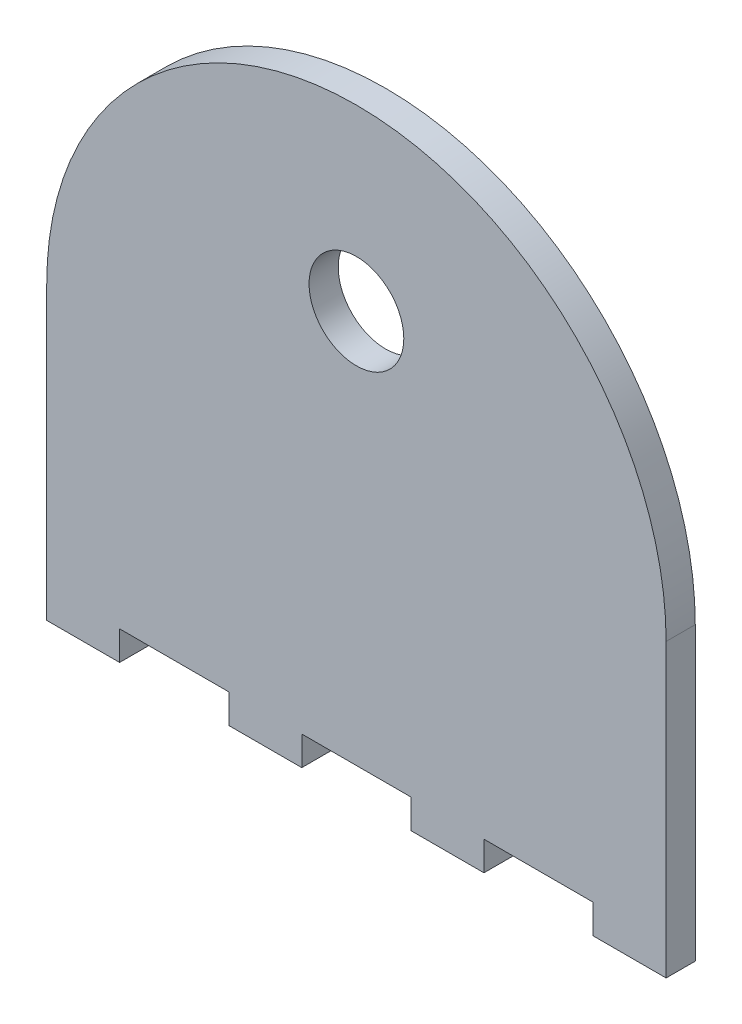
ISO-10303-21;
HEADER;
FILE_DESCRIPTION(('STEP AP214'),'2;1');
FILE_NAME('part.step','',(''),(''),'','','');
FILE_SCHEMA(('AUTOMOTIVE_DESIGN { 1 0 10303 214 1 1 1 1 }'));
ENDSEC;
DATA;
#1=APPLICATION_CONTEXT('core data for automotive mechanical design processes');
#2=APPLICATION_PROTOCOL_DEFINITION('international standard','automotive_design',2000,#1);
#3=PRODUCT_CONTEXT('',#1,'mechanical');
#4=PRODUCT('Part','Part','',(#3));
#5=PRODUCT_RELATED_PRODUCT_CATEGORY('part','',(#4));
#6=PRODUCT_DEFINITION_FORMATION('','',#4);
#7=PRODUCT_DEFINITION_CONTEXT('part definition',#1,'design');
#8=PRODUCT_DEFINITION('design','',#6,#7);
#9=PRODUCT_DEFINITION_SHAPE('','',#8);
#10=(LENGTH_UNIT() NAMED_UNIT(*) SI_UNIT(.MILLI.,.METRE.));
#11=(NAMED_UNIT(*) PLANE_ANGLE_UNIT() SI_UNIT($,.RADIAN.));
#12=(NAMED_UNIT(*) SI_UNIT($,.STERADIAN.) SOLID_ANGLE_UNIT());
#13=UNCERTAINTY_MEASURE_WITH_UNIT(LENGTH_MEASURE(1.E-05),#10,'distance_accuracy_value','');
#14=(GEOMETRIC_REPRESENTATION_CONTEXT(3) GLOBAL_UNCERTAINTY_ASSIGNED_CONTEXT((#13)) GLOBAL_UNIT_ASSIGNED_CONTEXT((#10,
#11,#12)) REPRESENTATION_CONTEXT('',''));
#15=CARTESIAN_POINT('',(0.,0.,0.));
#16=DIRECTION('',(0.,0.,1.));
#17=DIRECTION('',(1.,0.,0.));
#18=AXIS2_PLACEMENT_3D('',#15,#16,#17);
#19=CARTESIAN_POINT('',(0.,0.,4.));
#20=DIRECTION('',(1.,0.,0.));
#21=DIRECTION('',(0.,0.,-1.));
#22=AXIS2_PLACEMENT_3D('',#19,#20,#21);
#23=PLANE('',#22);
#24=DIRECTION('',(0.,-1.,0.));
#25=VECTOR('',#24,1.);
#26=CARTESIAN_POINT('',(0.,0.,0.));
#27=LINE('',#26,#25);
#28=CARTESIAN_POINT('',(0.,40.,0.));
#29=VERTEX_POINT('',#28);
#30=CARTESIAN_POINT('',(0.,0.,0.));
#31=VERTEX_POINT('',#30);
#32=EDGE_CURVE('E187',#29,#31,#27,.T.);
#33=ORIENTED_EDGE('',*,*,#32,.T.);
#34=DIRECTION('',(0.,0.,-1.));
#35=VECTOR('',#34,1.);
#36=CARTESIAN_POINT('',(0.,0.,4.));
#37=LINE('',#36,#35);
#38=CARTESIAN_POINT('',(0.,0.,4.));
#39=VERTEX_POINT('',#38);
#40=EDGE_CURVE('E11',#39,#31,#37,.T.);
#41=ORIENTED_EDGE('',*,*,#40,.F.);
#42=DIRECTION('',(0.,-1.,0.));
#43=VECTOR('',#42,1.);
#44=CARTESIAN_POINT('',(0.,0.,4.));
#45=LINE('',#44,#43);
#46=CARTESIAN_POINT('',(0.,40.,4.));
#47=VERTEX_POINT('',#46);
#48=EDGE_CURVE('E234',#47,#39,#45,.T.);
#49=ORIENTED_EDGE('',*,*,#48,.F.);
#50=DIRECTION('',(0.,0.,-1.));
#51=VECTOR('',#50,1.);
#52=CARTESIAN_POINT('',(0.,40.,4.));
#53=LINE('',#52,#51);
#54=EDGE_CURVE('E183',#47,#29,#53,.T.);
#55=ORIENTED_EDGE('',*,*,#54,.T.);
#56=EDGE_LOOP('',(#33,#41,#49,#55));
#57=FACE_BOUND('',#56,.T.);
#58=ADVANCED_FACE('F38',(#57),#23,.F.);
#59=CARTESIAN_POINT('',(0.,0.,4.));
#60=DIRECTION('',(0.,1.,0.));
#61=DIRECTION('',(0.,0.,1.));
#62=AXIS2_PLACEMENT_3D('',#59,#60,#61);
#63=PLANE('',#62);
#64=DIRECTION('',(1.,0.,0.));
#65=VECTOR('',#64,1.);
#66=CARTESIAN_POINT('',(0.,0.,0.));
#67=LINE('',#66,#65);
#68=CARTESIAN_POINT('',(10.,0.,0.));
#69=VERTEX_POINT('',#68);
#70=EDGE_CURVE('E191',#31,#69,#67,.T.);
#71=ORIENTED_EDGE('',*,*,#70,.T.);
#72=DIRECTION('',(0.,0.,-1.));
#73=VECTOR('',#72,1.);
#74=CARTESIAN_POINT('',(10.,0.,4.));
#75=LINE('',#74,#73);
#76=CARTESIAN_POINT('',(10.,0.,4.));
#77=VERTEX_POINT('',#76);
#78=EDGE_CURVE('E47',#77,#69,#75,.T.);
#79=ORIENTED_EDGE('',*,*,#78,.F.);
#80=DIRECTION('',(1.,0.,0.));
#81=VECTOR('',#80,1.);
#82=CARTESIAN_POINT('',(0.,0.,4.));
#83=LINE('',#82,#81);
#84=EDGE_CURVE('E122',#39,#77,#83,.T.);
#85=ORIENTED_EDGE('',*,*,#84,.F.);
#86=ORIENTED_EDGE('',*,*,#40,.T.);
#87=EDGE_LOOP('',(#71,#79,#85,#86));
#88=FACE_BOUND('',#87,.T.);
#89=ADVANCED_FACE('F358',(#88),#63,.F.);
#90=CARTESIAN_POINT('',(10.,0.,4.));
#91=DIRECTION('',(-1.,0.,0.));
#92=DIRECTION('',(0.,0.,1.));
#93=AXIS2_PLACEMENT_3D('',#90,#91,#92);
#94=PLANE('',#93);
#95=DIRECTION('',(0.,1.,0.));
#96=VECTOR('',#95,1.);
#97=CARTESIAN_POINT('',(10.,0.,0.));
#98=LINE('',#97,#96);
#99=CARTESIAN_POINT('',(10.,4.,0.));
#100=VERTEX_POINT('',#99);
#101=EDGE_CURVE('E195',#69,#100,#98,.T.);
#102=ORIENTED_EDGE('',*,*,#101,.T.);
#103=DIRECTION('',(0.,0.,-1.));
#104=VECTOR('',#103,1.);
#105=CARTESIAN_POINT('',(10.,4.,4.));
#106=LINE('',#105,#104);
#107=CARTESIAN_POINT('',(10.,4.,4.));
#108=VERTEX_POINT('',#107);
#109=EDGE_CURVE('E277',#108,#100,#106,.T.);
#110=ORIENTED_EDGE('',*,*,#109,.F.);
#111=DIRECTION('',(0.,1.,0.));
#112=VECTOR('',#111,1.);
#113=CARTESIAN_POINT('',(10.,0.,4.));
#114=LINE('',#113,#112);
#115=EDGE_CURVE('E287',#77,#108,#114,.T.);
#116=ORIENTED_EDGE('',*,*,#115,.F.);
#117=ORIENTED_EDGE('',*,*,#78,.T.);
#118=EDGE_LOOP('',(#102,#110,#116,#117));
#119=FACE_BOUND('',#118,.T.);
#120=ADVANCED_FACE('F285',(#119),#94,.F.);
#121=CARTESIAN_POINT('',(10.,4.,4.));
#122=DIRECTION('',(0.,1.,0.));
#123=DIRECTION('',(0.,0.,1.));
#124=AXIS2_PLACEMENT_3D('',#121,#122,#123);
#125=PLANE('',#124);
#126=DIRECTION('',(1.,0.,0.));
#127=VECTOR('',#126,1.);
#128=CARTESIAN_POINT('',(10.,4.,0.));
#129=LINE('',#128,#127);
#130=CARTESIAN_POINT('',(25.,4.,0.));
#131=VERTEX_POINT('',#130);
#132=EDGE_CURVE('E198',#100,#131,#129,.T.);
#133=ORIENTED_EDGE('',*,*,#132,.T.);
#134=DIRECTION('',(0.,0.,-1.));
#135=VECTOR('',#134,1.);
#136=CARTESIAN_POINT('',(25.,4.,4.));
#137=LINE('',#136,#135);
#138=CARTESIAN_POINT('',(25.,4.,4.));
#139=VERTEX_POINT('',#138);
#140=EDGE_CURVE('E273',#139,#131,#137,.T.);
#141=ORIENTED_EDGE('',*,*,#140,.F.);
#142=DIRECTION('',(1.,0.,0.));
#143=VECTOR('',#142,1.);
#144=CARTESIAN_POINT('',(10.,4.,4.));
#145=LINE('',#144,#143);
#146=EDGE_CURVE('E306',#108,#139,#145,.T.);
#147=ORIENTED_EDGE('',*,*,#146,.F.);
#148=ORIENTED_EDGE('',*,*,#109,.T.);
#149=EDGE_LOOP('',(#133,#141,#147,#148));
#150=FACE_BOUND('',#149,.T.);
#151=ADVANCED_FACE('F296',(#150),#125,.F.);
#152=CARTESIAN_POINT('',(25.,4.,4.));
#153=DIRECTION('',(1.,0.,0.));
#154=DIRECTION('',(0.,0.,-1.));
#155=AXIS2_PLACEMENT_3D('',#152,#153,#154);
#156=PLANE('',#155);
#157=DIRECTION('',(0.,-1.,0.));
#158=VECTOR('',#157,1.);
#159=CARTESIAN_POINT('',(25.,4.,0.));
#160=LINE('',#159,#158);
#161=CARTESIAN_POINT('',(25.,0.,0.));
#162=VERTEX_POINT('',#161);
#163=EDGE_CURVE('E201',#131,#162,#160,.T.);
#164=ORIENTED_EDGE('',*,*,#163,.T.);
#165=DIRECTION('',(0.,0.,-1.));
#166=VECTOR('',#165,1.);
#167=CARTESIAN_POINT('',(25.,0.,4.));
#168=LINE('',#167,#166);
#169=CARTESIAN_POINT('',(25.,0.,4.));
#170=VERTEX_POINT('',#169);
#171=EDGE_CURVE('E269',#170,#162,#168,.T.);
#172=ORIENTED_EDGE('',*,*,#171,.F.);
#173=DIRECTION('',(0.,-1.,0.));
#174=VECTOR('',#173,1.);
#175=CARTESIAN_POINT('',(25.,4.,4.));
#176=LINE('',#175,#174);
#177=EDGE_CURVE('E302',#139,#170,#176,.T.);
#178=ORIENTED_EDGE('',*,*,#177,.F.);
#179=ORIENTED_EDGE('',*,*,#140,.T.);
#180=EDGE_LOOP('',(#164,#172,#178,#179));
#181=FACE_BOUND('',#180,.T.);
#182=ADVANCED_FACE('F300',(#181),#156,.F.);
#183=CARTESIAN_POINT('',(25.,0.,4.));
#184=DIRECTION('',(0.,1.,0.));
#185=DIRECTION('',(0.,0.,1.));
#186=AXIS2_PLACEMENT_3D('',#183,#184,#185);
#187=PLANE('',#186);
#188=DIRECTION('',(1.,0.,0.));
#189=VECTOR('',#188,1.);
#190=CARTESIAN_POINT('',(25.,0.,0.));
#191=LINE('',#190,#189);
#192=CARTESIAN_POINT('',(35.,0.,0.));
#193=VERTEX_POINT('',#192);
#194=EDGE_CURVE('E204',#162,#193,#191,.T.);
#195=ORIENTED_EDGE('',*,*,#194,.T.);
#196=DIRECTION('',(0.,0.,-1.));
#197=VECTOR('',#196,1.);
#198=CARTESIAN_POINT('',(35.,0.,4.));
#199=LINE('',#198,#197);
#200=CARTESIAN_POINT('',(35.,0.,4.));
#201=VERTEX_POINT('',#200);
#202=EDGE_CURVE('E265',#201,#193,#199,.T.);
#203=ORIENTED_EDGE('',*,*,#202,.F.);
#204=DIRECTION('',(1.,0.,0.));
#205=VECTOR('',#204,1.);
#206=CARTESIAN_POINT('',(25.,0.,4.));
#207=LINE('',#206,#205);
#208=EDGE_CURVE('E305',#170,#201,#207,.T.);
#209=ORIENTED_EDGE('',*,*,#208,.F.);
#210=ORIENTED_EDGE('',*,*,#171,.T.);
#211=EDGE_LOOP('',(#195,#203,#209,#210));
#212=FACE_BOUND('',#211,.T.);
#213=ADVANCED_FACE('F371',(#212),#187,.F.);
#214=CARTESIAN_POINT('',(35.,0.,4.));
#215=DIRECTION('',(-1.,0.,0.));
#216=DIRECTION('',(0.,0.,1.));
#217=AXIS2_PLACEMENT_3D('',#214,#215,#216);
#218=PLANE('',#217);
#219=DIRECTION('',(0.,1.,0.));
#220=VECTOR('',#219,1.);
#221=CARTESIAN_POINT('',(35.,0.,0.));
#222=LINE('',#221,#220);
#223=CARTESIAN_POINT('',(35.,4.,0.));
#224=VERTEX_POINT('',#223);
#225=EDGE_CURVE('E207',#193,#224,#222,.T.);
#226=ORIENTED_EDGE('',*,*,#225,.T.);
#227=DIRECTION('',(0.,0.,-1.));
#228=VECTOR('',#227,1.);
#229=CARTESIAN_POINT('',(35.,4.,4.));
#230=LINE('',#229,#228);
#231=CARTESIAN_POINT('',(35.,4.,4.));
#232=VERTEX_POINT('',#231);
#233=EDGE_CURVE('E261',#232,#224,#230,.T.);
#234=ORIENTED_EDGE('',*,*,#233,.F.);
#235=DIRECTION('',(0.,1.,0.));
#236=VECTOR('',#235,1.);
#237=CARTESIAN_POINT('',(35.,0.,4.));
#238=LINE('',#237,#236);
#239=EDGE_CURVE('E310',#201,#232,#238,.T.);
#240=ORIENTED_EDGE('',*,*,#239,.F.);
#241=ORIENTED_EDGE('',*,*,#202,.T.);
#242=EDGE_LOOP('',(#226,#234,#240,#241));
#243=FACE_BOUND('',#242,.T.);
#244=ADVANCED_FACE('F374',(#243),#218,.F.);
#245=CARTESIAN_POINT('',(35.,4.,4.));
#246=DIRECTION('',(0.,1.,0.));
#247=DIRECTION('',(0.,0.,1.));
#248=AXIS2_PLACEMENT_3D('',#245,#246,#247);
#249=PLANE('',#248);
#250=DIRECTION('',(1.,0.,0.));
#251=VECTOR('',#250,1.);
#252=CARTESIAN_POINT('',(35.,4.,0.));
#253=LINE('',#252,#251);
#254=CARTESIAN_POINT('',(50.,4.,0.));
#255=VERTEX_POINT('',#254);
#256=EDGE_CURVE('E210',#224,#255,#253,.T.);
#257=ORIENTED_EDGE('',*,*,#256,.T.);
#258=DIRECTION('',(0.,0.,-1.));
#259=VECTOR('',#258,1.);
#260=CARTESIAN_POINT('',(50.,4.,4.));
#261=LINE('',#260,#259);
#262=CARTESIAN_POINT('',(50.,4.,4.));
#263=VERTEX_POINT('',#262);
#264=EDGE_CURVE('E257',#263,#255,#261,.T.);
#265=ORIENTED_EDGE('',*,*,#264,.F.);
#266=DIRECTION('',(1.,0.,0.));
#267=VECTOR('',#266,1.);
#268=CARTESIAN_POINT('',(35.,4.,4.));
#269=LINE('',#268,#267);
#270=EDGE_CURVE('E317',#232,#263,#269,.T.);
#271=ORIENTED_EDGE('',*,*,#270,.F.);
#272=ORIENTED_EDGE('',*,*,#233,.T.);
#273=EDGE_LOOP('',(#257,#265,#271,#272));
#274=FACE_BOUND('',#273,.T.);
#275=ADVANCED_FACE('F378',(#274),#249,.F.);
#276=CARTESIAN_POINT('',(50.,4.,4.));
#277=DIRECTION('',(1.,0.,0.));
#278=DIRECTION('',(0.,0.,-1.));
#279=AXIS2_PLACEMENT_3D('',#276,#277,#278);
#280=PLANE('',#279);
#281=DIRECTION('',(0.,-1.,0.));
#282=VECTOR('',#281,1.);
#283=CARTESIAN_POINT('',(50.,4.,0.));
#284=LINE('',#283,#282);
#285=CARTESIAN_POINT('',(50.,0.,0.));
#286=VERTEX_POINT('',#285);
#287=EDGE_CURVE('E213',#255,#286,#284,.T.);
#288=ORIENTED_EDGE('',*,*,#287,.T.);
#289=DIRECTION('',(0.,0.,-1.));
#290=VECTOR('',#289,1.);
#291=CARTESIAN_POINT('',(50.,0.,4.));
#292=LINE('',#291,#290);
#293=CARTESIAN_POINT('',(50.,0.,4.));
#294=VERTEX_POINT('',#293);
#295=EDGE_CURVE('E253',#294,#286,#292,.T.);
#296=ORIENTED_EDGE('',*,*,#295,.F.);
#297=DIRECTION('',(0.,-1.,0.));
#298=VECTOR('',#297,1.);
#299=CARTESIAN_POINT('',(50.,4.,4.));
#300=LINE('',#299,#298);
#301=EDGE_CURVE('E320',#263,#294,#300,.T.);
#302=ORIENTED_EDGE('',*,*,#301,.F.);
#303=ORIENTED_EDGE('',*,*,#264,.T.);
#304=EDGE_LOOP('',(#288,#296,#302,#303));
#305=FACE_BOUND('',#304,.T.);
#306=ADVANCED_FACE('F382',(#305),#280,.F.);
#307=CARTESIAN_POINT('',(50.,0.,4.));
#308=DIRECTION('',(0.,1.,0.));
#309=DIRECTION('',(0.,0.,1.));
#310=AXIS2_PLACEMENT_3D('',#307,#308,#309);
#311=PLANE('',#310);
#312=DIRECTION('',(1.,0.,0.));
#313=VECTOR('',#312,1.);
#314=CARTESIAN_POINT('',(50.,0.,0.));
#315=LINE('',#314,#313);
#316=CARTESIAN_POINT('',(60.,0.,0.));
#317=VERTEX_POINT('',#316);
#318=EDGE_CURVE('E216',#286,#317,#315,.T.);
#319=ORIENTED_EDGE('',*,*,#318,.T.);
#320=DIRECTION('',(0.,0.,-1.));
#321=VECTOR('',#320,1.);
#322=CARTESIAN_POINT('',(60.,0.,4.));
#323=LINE('',#322,#321);
#324=CARTESIAN_POINT('',(60.,0.,4.));
#325=VERTEX_POINT('',#324);
#326=EDGE_CURVE('E249',#325,#317,#323,.T.);
#327=ORIENTED_EDGE('',*,*,#326,.F.);
#328=DIRECTION('',(1.,0.,0.));
#329=VECTOR('',#328,1.);
#330=CARTESIAN_POINT('',(50.,0.,4.));
#331=LINE('',#330,#329);
#332=EDGE_CURVE('E323',#294,#325,#331,.T.);
#333=ORIENTED_EDGE('',*,*,#332,.F.);
#334=ORIENTED_EDGE('',*,*,#295,.T.);
#335=EDGE_LOOP('',(#319,#327,#333,#334));
#336=FACE_BOUND('',#335,.T.);
#337=ADVANCED_FACE('F386',(#336),#311,.F.);
#338=CARTESIAN_POINT('',(60.,0.,4.));
#339=DIRECTION('',(-1.,0.,0.));
#340=DIRECTION('',(0.,-1.,0.));
#341=AXIS2_PLACEMENT_3D('',#338,#339,#340);
#342=PLANE('',#341);
#343=DIRECTION('',(0.,1.,0.));
#344=VECTOR('',#343,1.);
#345=CARTESIAN_POINT('',(60.,0.,0.));
#346=LINE('',#345,#344);
#347=CARTESIAN_POINT('',(60.,4.,0.));
#348=VERTEX_POINT('',#347);
#349=EDGE_CURVE('E219',#317,#348,#346,.T.);
#350=ORIENTED_EDGE('',*,*,#349,.T.);
#351=DIRECTION('',(0.,0.,-1.));
#352=VECTOR('',#351,1.);
#353=CARTESIAN_POINT('',(60.,4.,4.));
#354=LINE('',#353,#352);
#355=CARTESIAN_POINT('',(60.,4.,4.));
#356=VERTEX_POINT('',#355);
#357=EDGE_CURVE('E245',#356,#348,#354,.T.);
#358=ORIENTED_EDGE('',*,*,#357,.F.);
#359=DIRECTION('',(0.,1.,0.));
#360=VECTOR('',#359,1.);
#361=CARTESIAN_POINT('',(60.,0.,4.));
#362=LINE('',#361,#360);
#363=EDGE_CURVE('E326',#325,#356,#362,.T.);
#364=ORIENTED_EDGE('',*,*,#363,.F.);
#365=ORIENTED_EDGE('',*,*,#326,.T.);
#366=EDGE_LOOP('',(#350,#358,#364,#365));
#367=FACE_BOUND('',#366,.T.);
#368=ADVANCED_FACE('F390',(#367),#342,.F.);
#369=CARTESIAN_POINT('',(60.,4.,4.));
#370=DIRECTION('',(0.,1.,0.));
#371=DIRECTION('',(0.,0.,1.));
#372=AXIS2_PLACEMENT_3D('',#369,#370,#371);
#373=PLANE('',#372);
#374=DIRECTION('',(1.,0.,0.));
#375=VECTOR('',#374,1.);
#376=CARTESIAN_POINT('',(60.,4.,0.));
#377=LINE('',#376,#375);
#378=CARTESIAN_POINT('',(75.,4.,0.));
#379=VERTEX_POINT('',#378);
#380=EDGE_CURVE('E222',#348,#379,#377,.T.);
#381=ORIENTED_EDGE('',*,*,#380,.T.);
#382=DIRECTION('',(0.,0.,-1.));
#383=VECTOR('',#382,1.);
#384=CARTESIAN_POINT('',(75.,4.,4.));
#385=LINE('',#384,#383);
#386=CARTESIAN_POINT('',(75.,4.,4.));
#387=VERTEX_POINT('',#386);
#388=EDGE_CURVE('E241',#387,#379,#385,.T.);
#389=ORIENTED_EDGE('',*,*,#388,.F.);
#390=DIRECTION('',(1.,0.,0.));
#391=VECTOR('',#390,1.);
#392=CARTESIAN_POINT('',(60.,4.,4.));
#393=LINE('',#392,#391);
#394=EDGE_CURVE('E329',#356,#387,#393,.T.);
#395=ORIENTED_EDGE('',*,*,#394,.F.);
#396=ORIENTED_EDGE('',*,*,#357,.T.);
#397=EDGE_LOOP('',(#381,#389,#395,#396));
#398=FACE_BOUND('',#397,.T.);
#399=ADVANCED_FACE('F337',(#398),#373,.F.);
#400=CARTESIAN_POINT('',(75.,4.,4.));
#401=DIRECTION('',(1.,0.,0.));
#402=DIRECTION('',(0.,0.,-1.));
#403=AXIS2_PLACEMENT_3D('',#400,#401,#402);
#404=PLANE('',#403);
#405=DIRECTION('',(0.,-1.,0.));
#406=VECTOR('',#405,1.);
#407=CARTESIAN_POINT('',(75.,4.,0.));
#408=LINE('',#407,#406);
#409=CARTESIAN_POINT('',(75.,0.,0.));
#410=VERTEX_POINT('',#409);
#411=EDGE_CURVE('E225',#379,#410,#408,.T.);
#412=ORIENTED_EDGE('',*,*,#411,.T.);
#413=DIRECTION('',(0.,0.,-1.));
#414=VECTOR('',#413,1.);
#415=CARTESIAN_POINT('',(75.,0.,4.));
#416=LINE('',#415,#414);
#417=CARTESIAN_POINT('',(75.,0.,4.));
#418=VERTEX_POINT('',#417);
#419=EDGE_CURVE('E176',#418,#410,#416,.T.);
#420=ORIENTED_EDGE('',*,*,#419,.F.);
#421=DIRECTION('',(0.,-1.,0.));
#422=VECTOR('',#421,1.);
#423=CARTESIAN_POINT('',(75.,4.,4.));
#424=LINE('',#423,#422);
#425=EDGE_CURVE('E165',#387,#418,#424,.T.);
#426=ORIENTED_EDGE('',*,*,#425,.F.);
#427=ORIENTED_EDGE('',*,*,#388,.T.);
#428=EDGE_LOOP('',(#412,#420,#426,#427));
#429=FACE_BOUND('',#428,.T.);
#430=ADVANCED_FACE('F341',(#429),#404,.F.);
#431=CARTESIAN_POINT('',(75.,0.,4.));
#432=DIRECTION('',(0.,1.,0.));
#433=DIRECTION('',(0.,0.,1.));
#434=AXIS2_PLACEMENT_3D('',#431,#432,#433);
#435=PLANE('',#434);
#436=DIRECTION('',(1.,0.,0.));
#437=VECTOR('',#436,1.);
#438=CARTESIAN_POINT('',(75.,0.,0.));
#439=LINE('',#438,#437);
#440=CARTESIAN_POINT('',(85.,0.,0.));
#441=VERTEX_POINT('',#440);
#442=EDGE_CURVE('E174',#410,#441,#439,.T.);
#443=ORIENTED_EDGE('',*,*,#442,.T.);
#444=DIRECTION('',(0.,0.,-1.));
#445=VECTOR('',#444,1.);
#446=CARTESIAN_POINT('',(85.,0.,4.));
#447=LINE('',#446,#445);
#448=CARTESIAN_POINT('',(85.,0.,4.));
#449=VERTEX_POINT('',#448);
#450=EDGE_CURVE('E171',#449,#441,#447,.T.);
#451=ORIENTED_EDGE('',*,*,#450,.F.);
#452=DIRECTION('',(1.,0.,0.));
#453=VECTOR('',#452,1.);
#454=CARTESIAN_POINT('',(75.,0.,4.));
#455=LINE('',#454,#453);
#456=EDGE_CURVE('E159',#418,#449,#455,.T.);
#457=ORIENTED_EDGE('',*,*,#456,.F.);
#458=ORIENTED_EDGE('',*,*,#419,.T.);
#459=EDGE_LOOP('',(#443,#451,#457,#458));
#460=FACE_BOUND('',#459,.T.);
#461=ADVANCED_FACE('F172',(#460),#435,.F.);
#462=CARTESIAN_POINT('',(85.,0.,4.));
#463=DIRECTION('',(-1.,0.,0.));
#464=DIRECTION('',(0.,0.,1.));
#465=AXIS2_PLACEMENT_3D('',#462,#463,#464);
#466=PLANE('',#465);
#467=DIRECTION('',(0.,1.,0.));
#468=VECTOR('',#467,1.);
#469=CARTESIAN_POINT('',(85.,0.,0.));
#470=LINE('',#469,#468);
#471=CARTESIAN_POINT('',(85.,40.,0.));
#472=VERTEX_POINT('',#471);
#473=EDGE_CURVE('E108',#441,#472,#470,.T.);
#474=ORIENTED_EDGE('',*,*,#473,.T.);
#475=DIRECTION('',(0.,0.,-1.));
#476=VECTOR('',#475,1.);
#477=CARTESIAN_POINT('',(85.,40.,4.));
#478=LINE('',#477,#476);
#479=CARTESIAN_POINT('',(85.,40.,4.));
#480=VERTEX_POINT('',#479);
#481=EDGE_CURVE('E177',#480,#472,#478,.T.);
#482=ORIENTED_EDGE('',*,*,#481,.F.);
#483=DIRECTION('',(0.,1.,0.));
#484=VECTOR('',#483,1.);
#485=CARTESIAN_POINT('',(85.,0.,4.));
#486=LINE('',#485,#484);
#487=EDGE_CURVE('E163',#449,#480,#486,.T.);
#488=ORIENTED_EDGE('',*,*,#487,.F.);
#489=ORIENTED_EDGE('',*,*,#450,.T.);
#490=EDGE_LOOP('',(#474,#482,#488,#489));
#491=FACE_BOUND('',#490,.T.);
#492=ADVANCED_FACE('F179',(#491),#466,.F.);
#493=CARTESIAN_POINT('',(42.5,40.,4.));
#494=DIRECTION('',(0.,0.,-1.));
#495=DIRECTION('',(-1.,0.,0.));
#496=AXIS2_PLACEMENT_3D('',#493,#494,#495);
#497=CYLINDRICAL_SURFACE('',#496,42.5);
#498=CARTESIAN_POINT('',(42.5,40.,0.));
#499=DIRECTION('',(0.,0.,1.));
#500=DIRECTION('',(-1.,0.,0.));
#501=AXIS2_PLACEMENT_3D('',#498,#499,#500);
#502=CIRCLE('',#501,42.5);
#503=EDGE_CURVE('E114',#472,#29,#502,.T.);
#504=ORIENTED_EDGE('',*,*,#503,.T.);
#505=ORIENTED_EDGE('',*,*,#54,.F.);
#506=CARTESIAN_POINT('',(42.5,40.,4.));
#507=DIRECTION('',(0.,0.,1.));
#508=DIRECTION('',(-1.,0.,0.));
#509=AXIS2_PLACEMENT_3D('',#506,#507,#508);
#510=CIRCLE('',#509,42.5);
#511=EDGE_CURVE('E55',#480,#47,#510,.T.);
#512=ORIENTED_EDGE('',*,*,#511,.F.);
#513=ORIENTED_EDGE('',*,*,#481,.T.);
#514=EDGE_LOOP('',(#504,#505,#512,#513));
#515=FACE_BOUND('',#514,.T.);
#516=ADVANCED_FACE('F345',(#515),#497,.T.);
#517=CARTESIAN_POINT('',(42.5,40.,4.));
#518=DIRECTION('',(0.,0.,-1.));
#519=DIRECTION('',(-1.,0.,0.));
#520=AXIS2_PLACEMENT_3D('',#517,#518,#519);
#521=PLANE('',#520);
#522=CARTESIAN_POINT('',(42.5,58.,4.));
#523=DIRECTION('',(0.,0.,1.));
#524=DIRECTION('',(1.,0.,0.));
#525=AXIS2_PLACEMENT_3D('',#522,#523,#524);
#526=CIRCLE('',#525,6.50000000000002);
#527=CARTESIAN_POINT('',(49.,58.,4.));
#528=VERTEX_POINT('',#527);
#529=EDGE_CURVE('E444',#528,#528,#526,.T.);
#530=ORIENTED_EDGE('',*,*,#529,.F.);
#531=EDGE_LOOP('',(#530));
#532=FACE_BOUND('',#531,.T.);
#533=ORIENTED_EDGE('',*,*,#48,.T.);
#534=ORIENTED_EDGE('',*,*,#84,.T.);
#535=ORIENTED_EDGE('',*,*,#115,.T.);
#536=ORIENTED_EDGE('',*,*,#146,.T.);
#537=ORIENTED_EDGE('',*,*,#177,.T.);
#538=ORIENTED_EDGE('',*,*,#208,.T.);
#539=ORIENTED_EDGE('',*,*,#239,.T.);
#540=ORIENTED_EDGE('',*,*,#270,.T.);
#541=ORIENTED_EDGE('',*,*,#301,.T.);
#542=ORIENTED_EDGE('',*,*,#332,.T.);
#543=ORIENTED_EDGE('',*,*,#363,.T.);
#544=ORIENTED_EDGE('',*,*,#394,.T.);
#545=ORIENTED_EDGE('',*,*,#425,.T.);
#546=ORIENTED_EDGE('',*,*,#456,.T.);
#547=ORIENTED_EDGE('',*,*,#487,.T.);
#548=ORIENTED_EDGE('',*,*,#511,.T.);
#549=EDGE_LOOP('',(#533,#534,#535,#536,#537,#538,#539,#540,#541,#542,#543,#544,#545,#546,#547,#548));
#550=FACE_BOUND('',#549,.T.);
#551=ADVANCED_FACE('F161',(#532,#550),#521,.F.);
#552=CARTESIAN_POINT('',(42.5,40.,0.));
#553=DIRECTION('',(0.,0.,-1.));
#554=DIRECTION('',(-1.,0.,0.));
#555=AXIS2_PLACEMENT_3D('',#552,#553,#554);
#556=PLANE('',#555);
#557=CARTESIAN_POINT('',(42.5,58.,0.));
#558=DIRECTION('',(0.,0.,1.));
#559=DIRECTION('',(1.,0.,0.));
#560=AXIS2_PLACEMENT_3D('',#557,#558,#559);
#561=CIRCLE('',#560,6.50000000000002);
#562=CARTESIAN_POINT('',(49.,58.,0.));
#563=VERTEX_POINT('',#562);
#564=EDGE_CURVE('E192',#563,#563,#561,.T.);
#565=ORIENTED_EDGE('',*,*,#564,.T.);
#566=EDGE_LOOP('',(#565));
#567=FACE_BOUND('',#566,.T.);
#568=ORIENTED_EDGE('',*,*,#32,.F.);
#569=ORIENTED_EDGE('',*,*,#503,.F.);
#570=ORIENTED_EDGE('',*,*,#473,.F.);
#571=ORIENTED_EDGE('',*,*,#442,.F.);
#572=ORIENTED_EDGE('',*,*,#411,.F.);
#573=ORIENTED_EDGE('',*,*,#380,.F.);
#574=ORIENTED_EDGE('',*,*,#349,.F.);
#575=ORIENTED_EDGE('',*,*,#318,.F.);
#576=ORIENTED_EDGE('',*,*,#287,.F.);
#577=ORIENTED_EDGE('',*,*,#256,.F.);
#578=ORIENTED_EDGE('',*,*,#225,.F.);
#579=ORIENTED_EDGE('',*,*,#194,.F.);
#580=ORIENTED_EDGE('',*,*,#163,.F.);
#581=ORIENTED_EDGE('',*,*,#132,.F.);
#582=ORIENTED_EDGE('',*,*,#101,.F.);
#583=ORIENTED_EDGE('',*,*,#70,.F.);
#584=EDGE_LOOP('',(#568,#569,#570,#571,#572,#573,#574,#575,#576,#577,#578,#579,#580,#581,#582,#583));
#585=FACE_BOUND('',#584,.T.);
#586=ADVANCED_FACE('F291',(#567,#585),#556,.T.);
#587=CARTESIAN_POINT('',(42.5,58.,0.));
#588=DIRECTION('',(0.,0.,1.));
#589=DIRECTION('',(1.,0.,0.));
#590=AXIS2_PLACEMENT_3D('',#587,#588,#589);
#591=CYLINDRICAL_SURFACE('',#590,6.50000000000002);
#592=ORIENTED_EDGE('',*,*,#564,.F.);
#593=EDGE_LOOP('',(#592));
#594=FACE_BOUND('',#593,.T.);
#595=ORIENTED_EDGE('',*,*,#529,.T.);
#596=EDGE_LOOP('',(#595));
#597=FACE_BOUND('',#596,.T.);
#598=ADVANCED_FACE('F423',(#594,#597),#591,.F.);
#599=CLOSED_SHELL('',(#58,#89,#120,#151,#182,#213,#244,#275,#306,#337,#368,#399,#430,#461,#492,
#516,#551,#586,#598));
#600=MANIFOLD_SOLID_BREP('B2',#599);
#601=ADVANCED_BREP_SHAPE_REPRESENTATION('',(#18,#600),#14);
#602=SHAPE_DEFINITION_REPRESENTATION(#9,#601);
ENDSEC;
END-ISO-10303-21;
